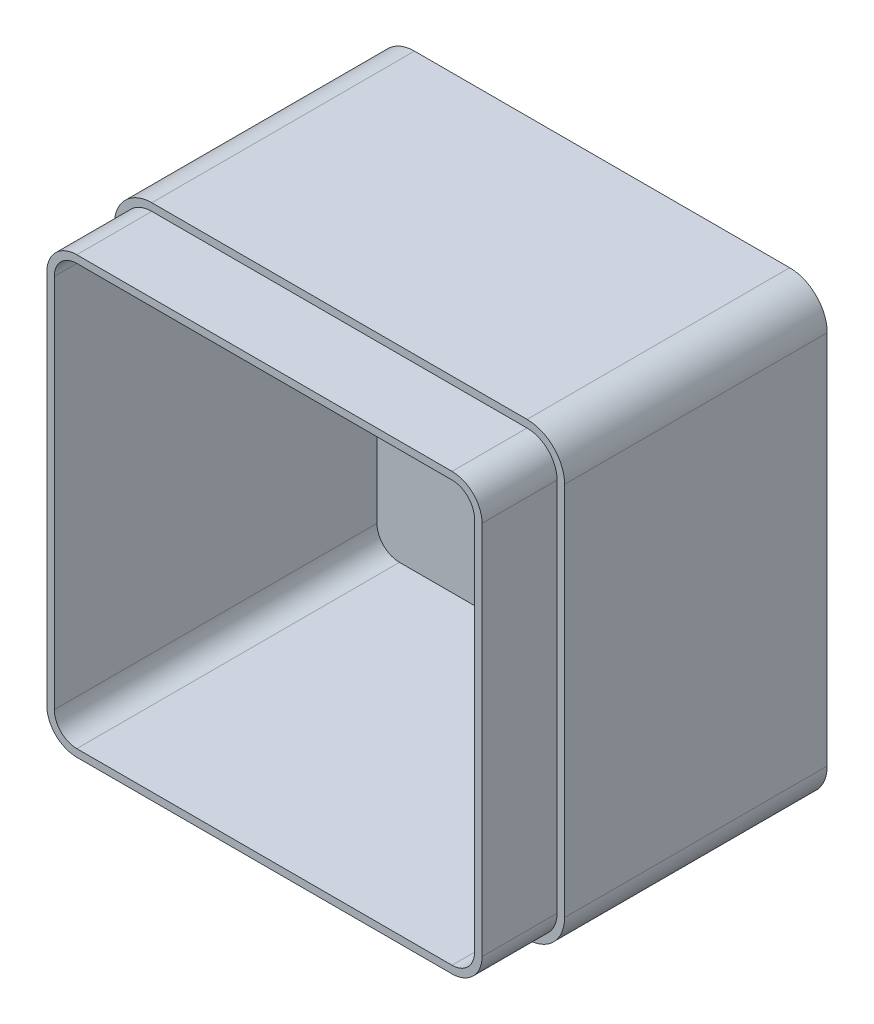
ISO-10303-21;
HEADER;
FILE_DESCRIPTION(('STEP AP214'),'2;1');
FILE_NAME('part.step','',(''),(''),'','','');
FILE_SCHEMA(('AUTOMOTIVE_DESIGN { 1 0 10303 214 1 1 1 1 }'));
ENDSEC;
DATA;
#1=APPLICATION_CONTEXT('core data for automotive mechanical design processes');
#2=APPLICATION_PROTOCOL_DEFINITION('international standard','automotive_design',2000,#1);
#3=PRODUCT_CONTEXT('',#1,'mechanical');
#4=PRODUCT('Part','Part','',(#3));
#5=PRODUCT_RELATED_PRODUCT_CATEGORY('part','',(#4));
#6=PRODUCT_DEFINITION_FORMATION('','',#4);
#7=PRODUCT_DEFINITION_CONTEXT('part definition',#1,'design');
#8=PRODUCT_DEFINITION('design','',#6,#7);
#9=PRODUCT_DEFINITION_SHAPE('','',#8);
#10=(LENGTH_UNIT() NAMED_UNIT(*) SI_UNIT(.MILLI.,.METRE.));
#11=(NAMED_UNIT(*) PLANE_ANGLE_UNIT() SI_UNIT($,.RADIAN.));
#12=(NAMED_UNIT(*) SI_UNIT($,.STERADIAN.) SOLID_ANGLE_UNIT());
#13=UNCERTAINTY_MEASURE_WITH_UNIT(LENGTH_MEASURE(1.E-05),#10,'distance_accuracy_value','');
#14=(GEOMETRIC_REPRESENTATION_CONTEXT(3) GLOBAL_UNCERTAINTY_ASSIGNED_CONTEXT((#13)) GLOBAL_UNIT_ASSIGNED_CONTEXT((#10,
#11,#12)) REPRESENTATION_CONTEXT('',''));
#15=CARTESIAN_POINT('',(0.,0.,0.));
#16=DIRECTION('',(0.,0.,1.));
#17=DIRECTION('',(1.,0.,0.));
#18=AXIS2_PLACEMENT_3D('',#15,#16,#17);
#19=CARTESIAN_POINT('',(0.,0.,90.));
#20=DIRECTION('',(0.,0.,-1.));
#21=DIRECTION('',(-1.,0.,0.));
#22=AXIS2_PLACEMENT_3D('',#19,#20,#21);
#23=PLANE('',#22);
#24=DIRECTION('',(0.,-1.,0.));
#25=VECTOR('',#24,1.);
#26=CARTESIAN_POINT('',(4.,0.,90.));
#27=LINE('',#26,#25);
#28=CARTESIAN_POINT('',(4.,110.,90.));
#29=VERTEX_POINT('',#28);
#30=CARTESIAN_POINT('',(4.,9.99999999999999,90.));
#31=VERTEX_POINT('',#30);
#32=EDGE_CURVE('E304',#29,#31,#27,.T.);
#33=ORIENTED_EDGE('',*,*,#32,.F.);
#34=CARTESIAN_POINT('',(10.,110.,90.));
#35=DIRECTION('',(0.,0.,-1.));
#36=DIRECTION('',(-1.,0.,0.));
#37=AXIS2_PLACEMENT_3D('',#34,#35,#36);
#38=CIRCLE('',#37,6.);
#39=CARTESIAN_POINT('',(9.99999999999999,116.,90.));
#40=VERTEX_POINT('',#39);
#41=EDGE_CURVE('E337',#40,#29,#38,.F.);
#42=ORIENTED_EDGE('',*,*,#41,.F.);
#43=DIRECTION('',(-1.,0.,0.));
#44=VECTOR('',#43,1.);
#45=CARTESIAN_POINT('',(0.,116.,90.));
#46=LINE('',#45,#44);
#47=CARTESIAN_POINT('',(110.,116.,90.));
#48=VERTEX_POINT('',#47);
#49=EDGE_CURVE('E314',#48,#40,#46,.T.);
#50=ORIENTED_EDGE('',*,*,#49,.F.);
#51=CARTESIAN_POINT('',(110.,110.,90.));
#52=DIRECTION('',(0.,0.,-1.));
#53=DIRECTION('',(-1.,0.,0.));
#54=AXIS2_PLACEMENT_3D('',#51,#52,#53);
#55=CIRCLE('',#54,6.);
#56=CARTESIAN_POINT('',(116.,110.,90.));
#57=VERTEX_POINT('',#56);
#58=EDGE_CURVE('E288',#57,#48,#55,.F.);
#59=ORIENTED_EDGE('',*,*,#58,.F.);
#60=DIRECTION('',(0.,1.,0.));
#61=VECTOR('',#60,1.);
#62=CARTESIAN_POINT('',(116.,0.,90.));
#63=LINE('',#62,#61);
#64=CARTESIAN_POINT('',(116.,9.99999999999999,90.));
#65=VERTEX_POINT('',#64);
#66=EDGE_CURVE('E335',#65,#57,#63,.T.);
#67=ORIENTED_EDGE('',*,*,#66,.F.);
#68=CARTESIAN_POINT('',(110.,10.,90.));
#69=DIRECTION('',(0.,0.,-1.));
#70=DIRECTION('',(-1.,0.,0.));
#71=AXIS2_PLACEMENT_3D('',#68,#69,#70);
#72=CIRCLE('',#71,6.);
#73=CARTESIAN_POINT('',(110.,4.,90.));
#74=VERTEX_POINT('',#73);
#75=EDGE_CURVE('E332',#74,#65,#72,.F.);
#76=ORIENTED_EDGE('',*,*,#75,.F.);
#77=DIRECTION('',(1.,0.,0.));
#78=VECTOR('',#77,1.);
#79=CARTESIAN_POINT('',(0.,4.,90.));
#80=LINE('',#79,#78);
#81=CARTESIAN_POINT('',(9.99999999999999,4.,90.));
#82=VERTEX_POINT('',#81);
#83=EDGE_CURVE('E330',#82,#74,#80,.T.);
#84=ORIENTED_EDGE('',*,*,#83,.F.);
#85=CARTESIAN_POINT('',(10.,10.,90.));
#86=DIRECTION('',(0.,0.,-1.));
#87=DIRECTION('',(-1.,0.,0.));
#88=AXIS2_PLACEMENT_3D('',#85,#86,#87);
#89=CIRCLE('',#88,6.);
#90=EDGE_CURVE('E321',#31,#82,#89,.F.);
#91=ORIENTED_EDGE('',*,*,#90,.F.);
#92=EDGE_LOOP('',(#33,#42,#50,#59,#67,#76,#84,#91));
#93=FACE_BOUND('',#92,.T.);
#94=CARTESIAN_POINT('',(10.,110.,90.));
#95=DIRECTION('',(0.,0.,1.));
#96=DIRECTION('',(1.,0.,0.));
#97=AXIS2_PLACEMENT_3D('',#94,#95,#96);
#98=CIRCLE('',#97,8.);
#99=CARTESIAN_POINT('',(9.99999999999999,118.,90.));
#100=VERTEX_POINT('',#99);
#101=CARTESIAN_POINT('',(2.,110.,90.));
#102=VERTEX_POINT('',#101);
#103=EDGE_CURVE('E240',#100,#102,#98,.T.);
#104=ORIENTED_EDGE('',*,*,#103,.T.);
#105=DIRECTION('',(0.,-1.,0.));
#106=VECTOR('',#105,1.);
#107=CARTESIAN_POINT('',(2.,110.,90.));
#108=LINE('',#107,#106);
#109=CARTESIAN_POINT('',(2.,9.99999999999999,90.));
#110=VERTEX_POINT('',#109);
#111=EDGE_CURVE('E200',#102,#110,#108,.T.);
#112=ORIENTED_EDGE('',*,*,#111,.T.);
#113=CARTESIAN_POINT('',(10.,10.,90.));
#114=DIRECTION('',(0.,0.,1.));
#115=DIRECTION('',(1.,0.,0.));
#116=AXIS2_PLACEMENT_3D('',#113,#114,#115);
#117=CIRCLE('',#116,8.);
#118=CARTESIAN_POINT('',(9.99999999999999,2.,90.));
#119=VERTEX_POINT('',#118);
#120=EDGE_CURVE('E48',#110,#119,#117,.T.);
#121=ORIENTED_EDGE('',*,*,#120,.T.);
#122=DIRECTION('',(1.,0.,0.));
#123=VECTOR('',#122,1.);
#124=CARTESIAN_POINT('',(10.,2.,90.));
#125=LINE('',#124,#123);
#126=CARTESIAN_POINT('',(110.,2.,90.));
#127=VERTEX_POINT('',#126);
#128=EDGE_CURVE('E244',#119,#127,#125,.T.);
#129=ORIENTED_EDGE('',*,*,#128,.T.);
#130=CARTESIAN_POINT('',(110.,10.,90.));
#131=DIRECTION('',(0.,0.,1.));
#132=DIRECTION('',(1.,0.,0.));
#133=AXIS2_PLACEMENT_3D('',#130,#131,#132);
#134=CIRCLE('',#133,7.99999999999999);
#135=CARTESIAN_POINT('',(118.,10.,90.));
#136=VERTEX_POINT('',#135);
#137=EDGE_CURVE('E247',#127,#136,#134,.T.);
#138=ORIENTED_EDGE('',*,*,#137,.T.);
#139=DIRECTION('',(0.,1.,0.));
#140=VECTOR('',#139,1.);
#141=CARTESIAN_POINT('',(118.,10.,90.));
#142=LINE('',#141,#140);
#143=CARTESIAN_POINT('',(118.,110.,90.));
#144=VERTEX_POINT('',#143);
#145=EDGE_CURVE('E250',#136,#144,#142,.T.);
#146=ORIENTED_EDGE('',*,*,#145,.T.);
#147=CARTESIAN_POINT('',(110.,110.,90.));
#148=DIRECTION('',(0.,0.,1.));
#149=DIRECTION('',(1.,0.,0.));
#150=AXIS2_PLACEMENT_3D('',#147,#148,#149);
#151=CIRCLE('',#150,7.99999999999999);
#152=CARTESIAN_POINT('',(110.,118.,90.));
#153=VERTEX_POINT('',#152);
#154=EDGE_CURVE('E223',#144,#153,#151,.T.);
#155=ORIENTED_EDGE('',*,*,#154,.T.);
#156=DIRECTION('',(-1.,0.,0.));
#157=VECTOR('',#156,1.);
#158=CARTESIAN_POINT('',(110.,118.,90.));
#159=LINE('',#158,#157);
#160=EDGE_CURVE('E220',#153,#100,#159,.T.);
#161=ORIENTED_EDGE('',*,*,#160,.T.);
#162=EDGE_LOOP('',(#104,#112,#121,#129,#138,#146,#155,#161));
#163=FACE_BOUND('',#162,.T.);
#164=ADVANCED_FACE('F33',(#93,#163),#23,.F.);
#165=CARTESIAN_POINT('',(4.,0.,90.));
#166=DIRECTION('',(1.,0.,0.));
#167=DIRECTION('',(0.,0.,-1.));
#168=AXIS2_PLACEMENT_3D('',#165,#166,#167);
#169=PLANE('',#168);
#170=DIRECTION('',(0.,-1.,0.));
#171=VECTOR('',#170,1.);
#172=CARTESIAN_POINT('',(4.,0.,4.));
#173=LINE('',#172,#171);
#174=CARTESIAN_POINT('',(4.,110.,4.));
#175=VERTEX_POINT('',#174);
#176=CARTESIAN_POINT('',(4.,9.99999999999999,4.));
#177=VERTEX_POINT('',#176);
#178=EDGE_CURVE('E282',#175,#177,#173,.T.);
#179=ORIENTED_EDGE('',*,*,#178,.F.);
#180=DIRECTION('',(0.,0.,-1.));
#181=VECTOR('',#180,1.);
#182=CARTESIAN_POINT('',(4.,110.,90.));
#183=LINE('',#182,#181);
#184=EDGE_CURVE('E289',#29,#175,#183,.T.);
#185=ORIENTED_EDGE('',*,*,#184,.F.);
#186=ORIENTED_EDGE('',*,*,#32,.T.);
#187=DIRECTION('',(0.,0.,-1.));
#188=VECTOR('',#187,1.);
#189=CARTESIAN_POINT('',(4.,9.99999999999999,90.));
#190=LINE('',#189,#188);
#191=EDGE_CURVE('E286',#177,#31,#190,.F.);
#192=ORIENTED_EDGE('',*,*,#191,.F.);
#193=EDGE_LOOP('',(#179,#185,#186,#192));
#194=FACE_BOUND('',#193,.T.);
#195=ADVANCED_FACE('F426',(#194),#169,.T.);
#196=CARTESIAN_POINT('',(0.,4.,90.));
#197=DIRECTION('',(0.,1.,0.));
#198=DIRECTION('',(0.,0.,1.));
#199=AXIS2_PLACEMENT_3D('',#196,#197,#198);
#200=PLANE('',#199);
#201=ORIENTED_EDGE('',*,*,#83,.T.);
#202=DIRECTION('',(0.,0.,1.));
#203=VECTOR('',#202,1.);
#204=CARTESIAN_POINT('',(110.,4.,90.));
#205=LINE('',#204,#203);
#206=CARTESIAN_POINT('',(110.,4.,4.));
#207=VERTEX_POINT('',#206);
#208=EDGE_CURVE('E312',#207,#74,#205,.T.);
#209=ORIENTED_EDGE('',*,*,#208,.F.);
#210=DIRECTION('',(1.,0.,0.));
#211=VECTOR('',#210,1.);
#212=CARTESIAN_POINT('',(0.,4.,4.));
#213=LINE('',#212,#211);
#214=CARTESIAN_POINT('',(9.99999999999999,4.,4.));
#215=VERTEX_POINT('',#214);
#216=EDGE_CURVE('E285',#215,#207,#213,.T.);
#217=ORIENTED_EDGE('',*,*,#216,.F.);
#218=DIRECTION('',(0.,0.,1.));
#219=VECTOR('',#218,1.);
#220=CARTESIAN_POINT('',(9.99999999999999,4.,90.));
#221=LINE('',#220,#219);
#222=EDGE_CURVE('E306',#82,#215,#221,.F.);
#223=ORIENTED_EDGE('',*,*,#222,.F.);
#224=EDGE_LOOP('',(#201,#209,#217,#223));
#225=FACE_BOUND('',#224,.T.);
#226=ADVANCED_FACE('F434',(#225),#200,.T.);
#227=CARTESIAN_POINT('',(116.,0.,90.));
#228=DIRECTION('',(-1.,0.,0.));
#229=DIRECTION('',(0.,0.,1.));
#230=AXIS2_PLACEMENT_3D('',#227,#228,#229);
#231=PLANE('',#230);
#232=ORIENTED_EDGE('',*,*,#66,.T.);
#233=DIRECTION('',(0.,0.,1.));
#234=VECTOR('',#233,1.);
#235=CARTESIAN_POINT('',(116.,110.,90.));
#236=LINE('',#235,#234);
#237=CARTESIAN_POINT('',(116.,110.,4.));
#238=VERTEX_POINT('',#237);
#239=EDGE_CURVE('E319',#238,#57,#236,.T.);
#240=ORIENTED_EDGE('',*,*,#239,.F.);
#241=DIRECTION('',(0.,1.,0.));
#242=VECTOR('',#241,1.);
#243=CARTESIAN_POINT('',(116.,0.,4.));
#244=LINE('',#243,#242);
#245=CARTESIAN_POINT('',(116.,9.99999999999999,4.));
#246=VERTEX_POINT('',#245);
#247=EDGE_CURVE('E295',#246,#238,#244,.T.);
#248=ORIENTED_EDGE('',*,*,#247,.F.);
#249=DIRECTION('',(0.,0.,1.));
#250=VECTOR('',#249,1.);
#251=CARTESIAN_POINT('',(116.,9.99999999999999,90.));
#252=LINE('',#251,#250);
#253=EDGE_CURVE('E315',#65,#246,#252,.F.);
#254=ORIENTED_EDGE('',*,*,#253,.F.);
#255=EDGE_LOOP('',(#232,#240,#248,#254));
#256=FACE_BOUND('',#255,.T.);
#257=ADVANCED_FACE('F554',(#256),#231,.T.);
#258=CARTESIAN_POINT('',(0.,116.,90.));
#259=DIRECTION('',(0.,-1.,0.));
#260=DIRECTION('',(0.,0.,-1.));
#261=AXIS2_PLACEMENT_3D('',#258,#259,#260);
#262=PLANE('',#261);
#263=DIRECTION('',(-1.,0.,0.));
#264=VECTOR('',#263,1.);
#265=CARTESIAN_POINT('',(0.,116.,4.));
#266=LINE('',#265,#264);
#267=CARTESIAN_POINT('',(110.,116.,4.));
#268=VERTEX_POINT('',#267);
#269=CARTESIAN_POINT('',(9.99999999999999,116.,4.));
#270=VERTEX_POINT('',#269);
#271=EDGE_CURVE('E301',#268,#270,#266,.T.);
#272=ORIENTED_EDGE('',*,*,#271,.F.);
#273=DIRECTION('',(0.,0.,-1.));
#274=VECTOR('',#273,1.);
#275=CARTESIAN_POINT('',(110.,116.,90.));
#276=LINE('',#275,#274);
#277=EDGE_CURVE('E318',#48,#268,#276,.T.);
#278=ORIENTED_EDGE('',*,*,#277,.F.);
#279=ORIENTED_EDGE('',*,*,#49,.T.);
#280=DIRECTION('',(0.,0.,-1.));
#281=VECTOR('',#280,1.);
#282=CARTESIAN_POINT('',(9.99999999999999,116.,90.));
#283=LINE('',#282,#281);
#284=EDGE_CURVE('E324',#270,#40,#283,.F.);
#285=ORIENTED_EDGE('',*,*,#284,.F.);
#286=EDGE_LOOP('',(#272,#278,#279,#285));
#287=FACE_BOUND('',#286,.T.);
#288=ADVANCED_FACE('F558',(#287),#262,.T.);
#289=CARTESIAN_POINT('',(0.,0.,4.));
#290=DIRECTION('',(0.,0.,-1.));
#291=DIRECTION('',(-1.,0.,0.));
#292=AXIS2_PLACEMENT_3D('',#289,#290,#291);
#293=PLANE('',#292);
#294=ORIENTED_EDGE('',*,*,#216,.T.);
#295=CARTESIAN_POINT('',(110.,10.,4.));
#296=DIRECTION('',(0.,0.,-1.));
#297=DIRECTION('',(-1.,0.,0.));
#298=AXIS2_PLACEMENT_3D('',#295,#296,#297);
#299=CIRCLE('',#298,6.);
#300=EDGE_CURVE('E297',#246,#207,#299,.T.);
#301=ORIENTED_EDGE('',*,*,#300,.F.);
#302=ORIENTED_EDGE('',*,*,#247,.T.);
#303=CARTESIAN_POINT('',(110.,110.,4.));
#304=DIRECTION('',(0.,0.,-1.));
#305=DIRECTION('',(-1.,0.,0.));
#306=AXIS2_PLACEMENT_3D('',#303,#304,#305);
#307=CIRCLE('',#306,6.);
#308=EDGE_CURVE('E300',#268,#238,#307,.T.);
#309=ORIENTED_EDGE('',*,*,#308,.F.);
#310=ORIENTED_EDGE('',*,*,#271,.T.);
#311=CARTESIAN_POINT('',(10.,110.,4.));
#312=DIRECTION('',(0.,0.,-1.));
#313=DIRECTION('',(-1.,0.,0.));
#314=AXIS2_PLACEMENT_3D('',#311,#312,#313);
#315=CIRCLE('',#314,6.);
#316=EDGE_CURVE('E298',#175,#270,#315,.T.);
#317=ORIENTED_EDGE('',*,*,#316,.F.);
#318=ORIENTED_EDGE('',*,*,#178,.T.);
#319=CARTESIAN_POINT('',(10.,10.,4.));
#320=DIRECTION('',(0.,0.,-1.));
#321=DIRECTION('',(-1.,0.,0.));
#322=AXIS2_PLACEMENT_3D('',#319,#320,#321);
#323=CIRCLE('',#322,6.);
#324=EDGE_CURVE('E292',#215,#177,#323,.T.);
#325=ORIENTED_EDGE('',*,*,#324,.F.);
#326=EDGE_LOOP('',(#294,#301,#302,#309,#310,#317,#318,#325));
#327=FACE_BOUND('',#326,.T.);
#328=ADVANCED_FACE('F562',(#327),#293,.F.);
#329=CARTESIAN_POINT('',(10.,10.,90.));
#330=DIRECTION('',(0.,0.,-1.));
#331=DIRECTION('',(-1.,0.,0.));
#332=AXIS2_PLACEMENT_3D('',#329,#330,#331);
#333=CYLINDRICAL_SURFACE('',#332,6.);
#334=ORIENTED_EDGE('',*,*,#90,.T.);
#335=ORIENTED_EDGE('',*,*,#222,.T.);
#336=ORIENTED_EDGE('',*,*,#324,.T.);
#337=ORIENTED_EDGE('',*,*,#191,.T.);
#338=EDGE_LOOP('',(#334,#335,#336,#337));
#339=FACE_BOUND('',#338,.T.);
#340=ADVANCED_FACE('F566',(#339),#333,.F.);
#341=CARTESIAN_POINT('',(110.,10.,90.));
#342=DIRECTION('',(0.,0.,-1.));
#343=DIRECTION('',(-1.,0.,0.));
#344=AXIS2_PLACEMENT_3D('',#341,#342,#343);
#345=CYLINDRICAL_SURFACE('',#344,6.);
#346=ORIENTED_EDGE('',*,*,#75,.T.);
#347=ORIENTED_EDGE('',*,*,#253,.T.);
#348=ORIENTED_EDGE('',*,*,#300,.T.);
#349=ORIENTED_EDGE('',*,*,#208,.T.);
#350=EDGE_LOOP('',(#346,#347,#348,#349));
#351=FACE_BOUND('',#350,.T.);
#352=ADVANCED_FACE('F570',(#351),#345,.F.);
#353=CARTESIAN_POINT('',(10.,110.,90.));
#354=DIRECTION('',(0.,0.,-1.));
#355=DIRECTION('',(-1.,0.,0.));
#356=AXIS2_PLACEMENT_3D('',#353,#354,#355);
#357=CYLINDRICAL_SURFACE('',#356,6.);
#358=ORIENTED_EDGE('',*,*,#41,.T.);
#359=ORIENTED_EDGE('',*,*,#184,.T.);
#360=ORIENTED_EDGE('',*,*,#316,.T.);
#361=ORIENTED_EDGE('',*,*,#284,.T.);
#362=EDGE_LOOP('',(#358,#359,#360,#361));
#363=FACE_BOUND('',#362,.T.);
#364=ADVANCED_FACE('F573',(#363),#357,.F.);
#365=CARTESIAN_POINT('',(110.,110.,90.));
#366=DIRECTION('',(0.,0.,-1.));
#367=DIRECTION('',(-1.,0.,0.));
#368=AXIS2_PLACEMENT_3D('',#365,#366,#367);
#369=CYLINDRICAL_SURFACE('',#368,6.);
#370=ORIENTED_EDGE('',*,*,#58,.T.);
#371=ORIENTED_EDGE('',*,*,#277,.T.);
#372=ORIENTED_EDGE('',*,*,#308,.T.);
#373=ORIENTED_EDGE('',*,*,#239,.T.);
#374=EDGE_LOOP('',(#370,#371,#372,#373));
#375=FACE_BOUND('',#374,.T.);
#376=ADVANCED_FACE('F441',(#375),#369,.F.);
#377=CARTESIAN_POINT('',(10.,110.,70.));
#378=DIRECTION('',(0.,0.,1.));
#379=DIRECTION('',(1.,0.,0.));
#380=AXIS2_PLACEMENT_3D('',#377,#378,#379);
#381=PLANE('',#380);
#382=DIRECTION('',(-1.,0.,0.));
#383=VECTOR('',#382,1.);
#384=CARTESIAN_POINT('',(110.,118.,70.));
#385=LINE('',#384,#383);
#386=CARTESIAN_POINT('',(110.,118.,70.));
#387=VERTEX_POINT('',#386);
#388=CARTESIAN_POINT('',(9.99999999999999,118.,70.));
#389=VERTEX_POINT('',#388);
#390=EDGE_CURVE('E206',#387,#389,#385,.T.);
#391=ORIENTED_EDGE('',*,*,#390,.F.);
#392=CARTESIAN_POINT('',(110.,110.,70.));
#393=DIRECTION('',(0.,0.,1.));
#394=DIRECTION('',(1.,0.,0.));
#395=AXIS2_PLACEMENT_3D('',#392,#393,#394);
#396=CIRCLE('',#395,7.99999999999999);
#397=CARTESIAN_POINT('',(118.,110.,70.));
#398=VERTEX_POINT('',#397);
#399=EDGE_CURVE('E236',#398,#387,#396,.T.);
#400=ORIENTED_EDGE('',*,*,#399,.F.);
#401=DIRECTION('',(0.,1.,0.));
#402=VECTOR('',#401,1.);
#403=CARTESIAN_POINT('',(118.,10.,70.));
#404=LINE('',#403,#402);
#405=CARTESIAN_POINT('',(118.,10.,70.));
#406=VERTEX_POINT('',#405);
#407=EDGE_CURVE('E233',#406,#398,#404,.T.);
#408=ORIENTED_EDGE('',*,*,#407,.F.);
#409=CARTESIAN_POINT('',(110.,10.,70.));
#410=DIRECTION('',(0.,0.,1.));
#411=DIRECTION('',(1.,0.,0.));
#412=AXIS2_PLACEMENT_3D('',#409,#410,#411);
#413=CIRCLE('',#412,7.99999999999999);
#414=CARTESIAN_POINT('',(110.,2.,70.));
#415=VERTEX_POINT('',#414);
#416=EDGE_CURVE('E230',#415,#406,#413,.T.);
#417=ORIENTED_EDGE('',*,*,#416,.F.);
#418=DIRECTION('',(1.,0.,0.));
#419=VECTOR('',#418,1.);
#420=CARTESIAN_POINT('',(10.,2.,70.));
#421=LINE('',#420,#419);
#422=CARTESIAN_POINT('',(9.99999999999999,2.,70.));
#423=VERTEX_POINT('',#422);
#424=EDGE_CURVE('E227',#423,#415,#421,.T.);
#425=ORIENTED_EDGE('',*,*,#424,.F.);
#426=CARTESIAN_POINT('',(10.,10.,70.));
#427=DIRECTION('',(0.,0.,1.));
#428=DIRECTION('',(1.,0.,0.));
#429=AXIS2_PLACEMENT_3D('',#426,#427,#428);
#430=CIRCLE('',#429,8.);
#431=CARTESIAN_POINT('',(2.,9.99999999999999,70.));
#432=VERTEX_POINT('',#431);
#433=EDGE_CURVE('E216',#432,#423,#430,.T.);
#434=ORIENTED_EDGE('',*,*,#433,.F.);
#435=DIRECTION('',(0.,-1.,0.));
#436=VECTOR('',#435,1.);
#437=CARTESIAN_POINT('',(2.,110.,70.));
#438=LINE('',#437,#436);
#439=CARTESIAN_POINT('',(2.,110.,70.));
#440=VERTEX_POINT('',#439);
#441=EDGE_CURVE('E198',#440,#432,#438,.T.);
#442=ORIENTED_EDGE('',*,*,#441,.F.);
#443=CARTESIAN_POINT('',(10.,110.,70.));
#444=DIRECTION('',(0.,0.,1.));
#445=DIRECTION('',(1.,0.,0.));
#446=AXIS2_PLACEMENT_3D('',#443,#444,#445);
#447=CIRCLE('',#446,8.);
#448=EDGE_CURVE('E212',#389,#440,#447,.T.);
#449=ORIENTED_EDGE('',*,*,#448,.F.);
#450=EDGE_LOOP('',(#391,#400,#408,#417,#425,#434,#442,#449));
#451=FACE_BOUND('',#450,.T.);
#452=CARTESIAN_POINT('',(10.,110.,70.));
#453=DIRECTION('',(0.,0.,1.));
#454=DIRECTION('',(1.,0.,0.));
#455=AXIS2_PLACEMENT_3D('',#452,#453,#454);
#456=CIRCLE('',#455,10.);
#457=CARTESIAN_POINT('',(10.,120.,70.));
#458=VERTEX_POINT('',#457);
#459=CARTESIAN_POINT('',(0.,110.,70.));
#460=VERTEX_POINT('',#459);
#461=EDGE_CURVE('E256',#458,#460,#456,.T.);
#462=ORIENTED_EDGE('',*,*,#461,.T.);
#463=DIRECTION('',(0.,-1.,0.));
#464=VECTOR('',#463,1.);
#465=CARTESIAN_POINT('',(0.,110.,70.));
#466=LINE('',#465,#464);
#467=CARTESIAN_POINT('',(0.,10.,70.));
#468=VERTEX_POINT('',#467);
#469=EDGE_CURVE('E269',#460,#468,#466,.T.);
#470=ORIENTED_EDGE('',*,*,#469,.T.);
#471=CARTESIAN_POINT('',(10.,10.,70.));
#472=DIRECTION('',(0.,0.,1.));
#473=DIRECTION('',(1.,0.,0.));
#474=AXIS2_PLACEMENT_3D('',#471,#472,#473);
#475=CIRCLE('',#474,10.);
#476=CARTESIAN_POINT('',(9.99999999999999,0.,70.));
#477=VERTEX_POINT('',#476);
#478=EDGE_CURVE('E271',#468,#477,#475,.T.);
#479=ORIENTED_EDGE('',*,*,#478,.T.);
#480=DIRECTION('',(1.,0.,0.));
#481=VECTOR('',#480,1.);
#482=CARTESIAN_POINT('',(9.99999999999999,0.,70.));
#483=LINE('',#482,#481);
#484=CARTESIAN_POINT('',(110.,0.,70.));
#485=VERTEX_POINT('',#484);
#486=EDGE_CURVE('E273',#477,#485,#483,.T.);
#487=ORIENTED_EDGE('',*,*,#486,.T.);
#488=CARTESIAN_POINT('',(110.,10.,70.));
#489=DIRECTION('',(0.,0.,1.));
#490=DIRECTION('',(1.,0.,0.));
#491=AXIS2_PLACEMENT_3D('',#488,#489,#490);
#492=CIRCLE('',#491,9.99999999999999);
#493=CARTESIAN_POINT('',(120.,10.,70.));
#494=VERTEX_POINT('',#493);
#495=EDGE_CURVE('E275',#485,#494,#492,.T.);
#496=ORIENTED_EDGE('',*,*,#495,.T.);
#497=DIRECTION('',(0.,1.,0.));
#498=VECTOR('',#497,1.);
#499=CARTESIAN_POINT('',(120.,10.,70.));
#500=LINE('',#499,#498);
#501=CARTESIAN_POINT('',(120.,110.,70.));
#502=VERTEX_POINT('',#501);
#503=EDGE_CURVE('E56',#494,#502,#500,.T.);
#504=ORIENTED_EDGE('',*,*,#503,.T.);
#505=CARTESIAN_POINT('',(110.,110.,70.));
#506=DIRECTION('',(0.,0.,1.));
#507=DIRECTION('',(1.,0.,0.));
#508=AXIS2_PLACEMENT_3D('',#505,#506,#507);
#509=CIRCLE('',#508,9.99999999999999);
#510=CARTESIAN_POINT('',(110.,120.,70.));
#511=VERTEX_POINT('',#510);
#512=EDGE_CURVE('E278',#502,#511,#509,.T.);
#513=ORIENTED_EDGE('',*,*,#512,.T.);
#514=DIRECTION('',(-1.,0.,0.));
#515=VECTOR('',#514,1.);
#516=CARTESIAN_POINT('',(110.,120.,70.));
#517=LINE('',#516,#515);
#518=EDGE_CURVE('E280',#511,#458,#517,.T.);
#519=ORIENTED_EDGE('',*,*,#518,.T.);
#520=EDGE_LOOP('',(#462,#470,#479,#487,#496,#504,#513,#519));
#521=FACE_BOUND('',#520,.T.);
#522=ADVANCED_FACE('F211',(#451,#521),#381,.T.);
#523=CARTESIAN_POINT('',(10.,110.,70.));
#524=DIRECTION('',(0.,0.,1.));
#525=DIRECTION('',(1.,0.,0.));
#526=AXIS2_PLACEMENT_3D('',#523,#524,#525);
#527=CYLINDRICAL_SURFACE('',#526,8.);
#528=ORIENTED_EDGE('',*,*,#103,.F.);
#529=DIRECTION('',(0.,0.,1.));
#530=VECTOR('',#529,1.);
#531=CARTESIAN_POINT('',(9.99999999999999,118.,70.));
#532=LINE('',#531,#530);
#533=EDGE_CURVE('E219',#389,#100,#532,.T.);
#534=ORIENTED_EDGE('',*,*,#533,.F.);
#535=ORIENTED_EDGE('',*,*,#448,.T.);
#536=DIRECTION('',(0.,0.,1.));
#537=VECTOR('',#536,1.);
#538=CARTESIAN_POINT('',(2.,110.,70.));
#539=LINE('',#538,#537);
#540=EDGE_CURVE('E195',#440,#102,#539,.T.);
#541=ORIENTED_EDGE('',*,*,#540,.T.);
#542=EDGE_LOOP('',(#528,#534,#535,#541));
#543=FACE_BOUND('',#542,.T.);
#544=ADVANCED_FACE('F218',(#543),#527,.T.);
#545=CARTESIAN_POINT('',(110.,118.,70.));
#546=DIRECTION('',(0.,1.,0.));
#547=DIRECTION('',(0.,0.,1.));
#548=AXIS2_PLACEMENT_3D('',#545,#546,#547);
#549=PLANE('',#548);
#550=ORIENTED_EDGE('',*,*,#160,.F.);
#551=DIRECTION('',(0.,0.,1.));
#552=VECTOR('',#551,1.);
#553=CARTESIAN_POINT('',(110.,118.,70.));
#554=LINE('',#553,#552);
#555=EDGE_CURVE('E257',#387,#153,#554,.T.);
#556=ORIENTED_EDGE('',*,*,#555,.F.);
#557=ORIENTED_EDGE('',*,*,#390,.T.);
#558=ORIENTED_EDGE('',*,*,#533,.T.);
#559=EDGE_LOOP('',(#550,#556,#557,#558));
#560=FACE_BOUND('',#559,.T.);
#561=ADVANCED_FACE('F482',(#560),#549,.T.);
#562=CARTESIAN_POINT('',(110.,110.,70.));
#563=DIRECTION('',(0.,0.,1.));
#564=DIRECTION('',(1.,0.,0.));
#565=AXIS2_PLACEMENT_3D('',#562,#563,#564);
#566=CYLINDRICAL_SURFACE('',#565,7.99999999999999);
#567=ORIENTED_EDGE('',*,*,#154,.F.);
#568=DIRECTION('',(0.,0.,1.));
#569=VECTOR('',#568,1.);
#570=CARTESIAN_POINT('',(118.,110.,70.));
#571=LINE('',#570,#569);
#572=EDGE_CURVE('E259',#398,#144,#571,.T.);
#573=ORIENTED_EDGE('',*,*,#572,.F.);
#574=ORIENTED_EDGE('',*,*,#399,.T.);
#575=ORIENTED_EDGE('',*,*,#555,.T.);
#576=EDGE_LOOP('',(#567,#573,#574,#575));
#577=FACE_BOUND('',#576,.T.);
#578=ADVANCED_FACE('F490',(#577),#566,.T.);
#579=CARTESIAN_POINT('',(118.,10.,70.));
#580=DIRECTION('',(1.,0.,0.));
#581=DIRECTION('',(0.,0.,-1.));
#582=AXIS2_PLACEMENT_3D('',#579,#580,#581);
#583=PLANE('',#582);
#584=ORIENTED_EDGE('',*,*,#145,.F.);
#585=DIRECTION('',(0.,0.,1.));
#586=VECTOR('',#585,1.);
#587=CARTESIAN_POINT('',(118.,10.,70.));
#588=LINE('',#587,#586);
#589=EDGE_CURVE('E261',#406,#136,#588,.T.);
#590=ORIENTED_EDGE('',*,*,#589,.F.);
#591=ORIENTED_EDGE('',*,*,#407,.T.);
#592=ORIENTED_EDGE('',*,*,#572,.T.);
#593=EDGE_LOOP('',(#584,#590,#591,#592));
#594=FACE_BOUND('',#593,.T.);
#595=ADVANCED_FACE('F499',(#594),#583,.T.);
#596=CARTESIAN_POINT('',(110.,10.,70.));
#597=DIRECTION('',(0.,0.,1.));
#598=DIRECTION('',(1.,0.,0.));
#599=AXIS2_PLACEMENT_3D('',#596,#597,#598);
#600=CYLINDRICAL_SURFACE('',#599,7.99999999999999);
#601=ORIENTED_EDGE('',*,*,#137,.F.);
#602=DIRECTION('',(0.,0.,1.));
#603=VECTOR('',#602,1.);
#604=CARTESIAN_POINT('',(110.,2.,70.));
#605=LINE('',#604,#603);
#606=EDGE_CURVE('E263',#415,#127,#605,.T.);
#607=ORIENTED_EDGE('',*,*,#606,.F.);
#608=ORIENTED_EDGE('',*,*,#416,.T.);
#609=ORIENTED_EDGE('',*,*,#589,.T.);
#610=EDGE_LOOP('',(#601,#607,#608,#609));
#611=FACE_BOUND('',#610,.T.);
#612=ADVANCED_FACE('F508',(#611),#600,.T.);
#613=CARTESIAN_POINT('',(10.,2.,70.));
#614=DIRECTION('',(0.,-1.,0.));
#615=DIRECTION('',(0.,0.,-1.));
#616=AXIS2_PLACEMENT_3D('',#613,#614,#615);
#617=PLANE('',#616);
#618=ORIENTED_EDGE('',*,*,#128,.F.);
#619=DIRECTION('',(0.,0.,1.));
#620=VECTOR('',#619,1.);
#621=CARTESIAN_POINT('',(9.99999999999999,2.,70.));
#622=LINE('',#621,#620);
#623=EDGE_CURVE('E265',#423,#119,#622,.T.);
#624=ORIENTED_EDGE('',*,*,#623,.F.);
#625=ORIENTED_EDGE('',*,*,#424,.T.);
#626=ORIENTED_EDGE('',*,*,#606,.T.);
#627=EDGE_LOOP('',(#618,#624,#625,#626));
#628=FACE_BOUND('',#627,.T.);
#629=ADVANCED_FACE('F517',(#628),#617,.T.);
#630=CARTESIAN_POINT('',(10.,10.,70.));
#631=DIRECTION('',(0.,0.,1.));
#632=DIRECTION('',(1.,0.,0.));
#633=AXIS2_PLACEMENT_3D('',#630,#631,#632);
#634=CYLINDRICAL_SURFACE('',#633,8.);
#635=ORIENTED_EDGE('',*,*,#120,.F.);
#636=DIRECTION('',(0.,0.,1.));
#637=VECTOR('',#636,1.);
#638=CARTESIAN_POINT('',(2.,9.99999999999999,70.));
#639=LINE('',#638,#637);
#640=EDGE_CURVE('E205',#432,#110,#639,.T.);
#641=ORIENTED_EDGE('',*,*,#640,.F.);
#642=ORIENTED_EDGE('',*,*,#433,.T.);
#643=ORIENTED_EDGE('',*,*,#623,.T.);
#644=EDGE_LOOP('',(#635,#641,#642,#643));
#645=FACE_BOUND('',#644,.T.);
#646=ADVANCED_FACE('F526',(#645),#634,.T.);
#647=CARTESIAN_POINT('',(2.,110.,70.));
#648=DIRECTION('',(-1.,0.,0.));
#649=DIRECTION('',(0.,0.,1.));
#650=AXIS2_PLACEMENT_3D('',#647,#648,#649);
#651=PLANE('',#650);
#652=ORIENTED_EDGE('',*,*,#111,.F.);
#653=ORIENTED_EDGE('',*,*,#540,.F.);
#654=ORIENTED_EDGE('',*,*,#441,.T.);
#655=ORIENTED_EDGE('',*,*,#640,.T.);
#656=EDGE_LOOP('',(#652,#653,#654,#655));
#657=FACE_BOUND('',#656,.T.);
#658=ADVANCED_FACE('F197',(#657),#651,.T.);
#659=CARTESIAN_POINT('',(0.,0.,0.));
#660=DIRECTION('',(0.,0.,-1.));
#661=DIRECTION('',(-1.,0.,0.));
#662=AXIS2_PLACEMENT_3D('',#659,#660,#661);
#663=PLANE('',#662);
#664=DIRECTION('',(1.,0.,0.));
#665=VECTOR('',#664,1.);
#666=CARTESIAN_POINT('',(0.,0.,0.));
#667=LINE('',#666,#665);
#668=CARTESIAN_POINT('',(10.,0.,0.));
#669=VERTEX_POINT('',#668);
#670=CARTESIAN_POINT('',(110.,0.,0.));
#671=VERTEX_POINT('',#670);
#672=EDGE_CURVE('E345',#669,#671,#667,.T.);
#673=ORIENTED_EDGE('',*,*,#672,.F.);
#674=CARTESIAN_POINT('',(10.,10.,0.));
#675=DIRECTION('',(0.,0.,-1.));
#676=DIRECTION('',(-1.,0.,0.));
#677=AXIS2_PLACEMENT_3D('',#674,#675,#676);
#678=CIRCLE('',#677,10.);
#679=CARTESIAN_POINT('',(0.,10.,0.));
#680=VERTEX_POINT('',#679);
#681=EDGE_CURVE('E365',#669,#680,#678,.T.);
#682=ORIENTED_EDGE('',*,*,#681,.T.);
#683=DIRECTION('',(0.,-1.,0.));
#684=VECTOR('',#683,1.);
#685=CARTESIAN_POINT('',(0.,0.,0.));
#686=LINE('',#685,#684);
#687=CARTESIAN_POINT('',(0.,110.,0.));
#688=VERTEX_POINT('',#687);
#689=EDGE_CURVE('E327',#688,#680,#686,.T.);
#690=ORIENTED_EDGE('',*,*,#689,.F.);
#691=CARTESIAN_POINT('',(10.,110.,0.));
#692=DIRECTION('',(0.,0.,-1.));
#693=DIRECTION('',(-1.,0.,0.));
#694=AXIS2_PLACEMENT_3D('',#691,#692,#693);
#695=CIRCLE('',#694,10.);
#696=CARTESIAN_POINT('',(10.,120.,0.));
#697=VERTEX_POINT('',#696);
#698=EDGE_CURVE('E361',#688,#697,#695,.T.);
#699=ORIENTED_EDGE('',*,*,#698,.T.);
#700=DIRECTION('',(-1.,0.,0.));
#701=VECTOR('',#700,1.);
#702=CARTESIAN_POINT('',(0.,120.,0.));
#703=LINE('',#702,#701);
#704=CARTESIAN_POINT('',(110.,120.,0.));
#705=VERTEX_POINT('',#704);
#706=EDGE_CURVE('E351',#705,#697,#703,.T.);
#707=ORIENTED_EDGE('',*,*,#706,.F.);
#708=CARTESIAN_POINT('',(110.,110.,0.));
#709=DIRECTION('',(0.,0.,-1.));
#710=DIRECTION('',(-1.,0.,0.));
#711=AXIS2_PLACEMENT_3D('',#708,#709,#710);
#712=CIRCLE('',#711,10.);
#713=CARTESIAN_POINT('',(120.,110.,0.));
#714=VERTEX_POINT('',#713);
#715=EDGE_CURVE('E359',#705,#714,#712,.T.);
#716=ORIENTED_EDGE('',*,*,#715,.T.);
#717=DIRECTION('',(0.,1.,0.));
#718=VECTOR('',#717,1.);
#719=CARTESIAN_POINT('',(120.,0.,0.));
#720=LINE('',#719,#718);
#721=CARTESIAN_POINT('',(120.,10.,0.));
#722=VERTEX_POINT('',#721);
#723=EDGE_CURVE('E348',#722,#714,#720,.T.);
#724=ORIENTED_EDGE('',*,*,#723,.F.);
#725=CARTESIAN_POINT('',(110.,10.,0.));
#726=DIRECTION('',(0.,0.,-1.));
#727=DIRECTION('',(-1.,0.,0.));
#728=AXIS2_PLACEMENT_3D('',#725,#726,#727);
#729=CIRCLE('',#728,10.);
#730=EDGE_CURVE('E363',#722,#671,#729,.T.);
#731=ORIENTED_EDGE('',*,*,#730,.T.);
#732=EDGE_LOOP('',(#673,#682,#690,#699,#707,#716,#724,#731));
#733=FACE_BOUND('',#732,.T.);
#734=ADVANCED_FACE('F388',(#733),#663,.T.);
#735=CARTESIAN_POINT('',(10.,110.,90.));
#736=DIRECTION('',(0.,0.,-1.));
#737=DIRECTION('',(-1.,0.,0.));
#738=AXIS2_PLACEMENT_3D('',#735,#736,#737);
#739=CYLINDRICAL_SURFACE('',#738,10.);
#740=DIRECTION('',(0.,0.,-1.));
#741=VECTOR('',#740,1.);
#742=CARTESIAN_POINT('',(0.,110.,90.));
#743=LINE('',#742,#741);
#744=EDGE_CURVE('E367',#460,#688,#743,.T.);
#745=ORIENTED_EDGE('',*,*,#744,.F.);
#746=ORIENTED_EDGE('',*,*,#461,.F.);
#747=DIRECTION('',(0.,0.,-1.));
#748=VECTOR('',#747,1.);
#749=CARTESIAN_POINT('',(10.,120.,90.));
#750=LINE('',#749,#748);
#751=EDGE_CURVE('E11',#697,#458,#750,.F.);
#752=ORIENTED_EDGE('',*,*,#751,.F.);
#753=ORIENTED_EDGE('',*,*,#698,.F.);
#754=EDGE_LOOP('',(#745,#746,#752,#753));
#755=FACE_BOUND('',#754,.T.);
#756=ADVANCED_FACE('F393',(#755),#739,.T.);
#757=CARTESIAN_POINT('',(110.,110.,90.));
#758=DIRECTION('',(0.,0.,-1.));
#759=DIRECTION('',(-1.,0.,0.));
#760=AXIS2_PLACEMENT_3D('',#757,#758,#759);
#761=CYLINDRICAL_SURFACE('',#760,10.);
#762=DIRECTION('',(0.,0.,-1.));
#763=VECTOR('',#762,1.);
#764=CARTESIAN_POINT('',(110.,120.,90.));
#765=LINE('',#764,#763);
#766=EDGE_CURVE('E41',#511,#705,#765,.T.);
#767=ORIENTED_EDGE('',*,*,#766,.F.);
#768=ORIENTED_EDGE('',*,*,#512,.F.);
#769=DIRECTION('',(0.,0.,-1.));
#770=VECTOR('',#769,1.);
#771=CARTESIAN_POINT('',(120.,110.,90.));
#772=LINE('',#771,#770);
#773=EDGE_CURVE('E372',#714,#502,#772,.F.);
#774=ORIENTED_EDGE('',*,*,#773,.F.);
#775=ORIENTED_EDGE('',*,*,#715,.F.);
#776=EDGE_LOOP('',(#767,#768,#774,#775));
#777=FACE_BOUND('',#776,.T.);
#778=ADVANCED_FACE('F35',(#777),#761,.T.);
#779=CARTESIAN_POINT('',(0.,120.,90.));
#780=DIRECTION('',(0.,-1.,0.));
#781=DIRECTION('',(0.,0.,-1.));
#782=AXIS2_PLACEMENT_3D('',#779,#780,#781);
#783=PLANE('',#782);
#784=ORIENTED_EDGE('',*,*,#518,.F.);
#785=ORIENTED_EDGE('',*,*,#766,.T.);
#786=ORIENTED_EDGE('',*,*,#706,.T.);
#787=ORIENTED_EDGE('',*,*,#751,.T.);
#788=EDGE_LOOP('',(#784,#785,#786,#787));
#789=FACE_BOUND('',#788,.T.);
#790=ADVANCED_FACE('F380',(#789),#783,.F.);
#791=CARTESIAN_POINT('',(110.,10.,90.));
#792=DIRECTION('',(0.,0.,-1.));
#793=DIRECTION('',(-1.,0.,0.));
#794=AXIS2_PLACEMENT_3D('',#791,#792,#793);
#795=CYLINDRICAL_SURFACE('',#794,10.);
#796=DIRECTION('',(0.,0.,-1.));
#797=VECTOR('',#796,1.);
#798=CARTESIAN_POINT('',(120.,10.,90.));
#799=LINE('',#798,#797);
#800=EDGE_CURVE('E375',#494,#722,#799,.T.);
#801=ORIENTED_EDGE('',*,*,#800,.F.);
#802=ORIENTED_EDGE('',*,*,#495,.F.);
#803=DIRECTION('',(0.,0.,-1.));
#804=VECTOR('',#803,1.);
#805=CARTESIAN_POINT('',(110.,0.,90.));
#806=LINE('',#805,#804);
#807=EDGE_CURVE('E354',#671,#485,#806,.F.);
#808=ORIENTED_EDGE('',*,*,#807,.F.);
#809=ORIENTED_EDGE('',*,*,#730,.F.);
#810=EDGE_LOOP('',(#801,#802,#808,#809));
#811=FACE_BOUND('',#810,.T.);
#812=ADVANCED_FACE('F412',(#811),#795,.T.);
#813=CARTESIAN_POINT('',(120.,0.,90.));
#814=DIRECTION('',(-1.,0.,0.));
#815=DIRECTION('',(0.,0.,1.));
#816=AXIS2_PLACEMENT_3D('',#813,#814,#815);
#817=PLANE('',#816);
#818=ORIENTED_EDGE('',*,*,#503,.F.);
#819=ORIENTED_EDGE('',*,*,#800,.T.);
#820=ORIENTED_EDGE('',*,*,#723,.T.);
#821=ORIENTED_EDGE('',*,*,#773,.T.);
#822=EDGE_LOOP('',(#818,#819,#820,#821));
#823=FACE_BOUND('',#822,.T.);
#824=ADVANCED_FACE('F414',(#823),#817,.F.);
#825=CARTESIAN_POINT('',(10.,10.,90.));
#826=DIRECTION('',(0.,0.,-1.));
#827=DIRECTION('',(-1.,0.,0.));
#828=AXIS2_PLACEMENT_3D('',#825,#826,#827);
#829=CYLINDRICAL_SURFACE('',#828,10.);
#830=DIRECTION('',(0.,0.,-1.));
#831=VECTOR('',#830,1.);
#832=CARTESIAN_POINT('',(10.,0.,90.));
#833=LINE('',#832,#831);
#834=EDGE_CURVE('E357',#477,#669,#833,.T.);
#835=ORIENTED_EDGE('',*,*,#834,.F.);
#836=ORIENTED_EDGE('',*,*,#478,.F.);
#837=DIRECTION('',(0.,0.,-1.));
#838=VECTOR('',#837,1.);
#839=CARTESIAN_POINT('',(0.,10.,90.));
#840=LINE('',#839,#838);
#841=EDGE_CURVE('E369',#680,#468,#840,.F.);
#842=ORIENTED_EDGE('',*,*,#841,.F.);
#843=ORIENTED_EDGE('',*,*,#681,.F.);
#844=EDGE_LOOP('',(#835,#836,#842,#843));
#845=FACE_BOUND('',#844,.T.);
#846=ADVANCED_FACE('F403',(#845),#829,.T.);
#847=CARTESIAN_POINT('',(0.,0.,90.));
#848=DIRECTION('',(0.,1.,0.));
#849=DIRECTION('',(0.,0.,1.));
#850=AXIS2_PLACEMENT_3D('',#847,#848,#849);
#851=PLANE('',#850);
#852=ORIENTED_EDGE('',*,*,#486,.F.);
#853=ORIENTED_EDGE('',*,*,#834,.T.);
#854=ORIENTED_EDGE('',*,*,#672,.T.);
#855=ORIENTED_EDGE('',*,*,#807,.T.);
#856=EDGE_LOOP('',(#852,#853,#854,#855));
#857=FACE_BOUND('',#856,.T.);
#858=ADVANCED_FACE('F407',(#857),#851,.F.);
#859=CARTESIAN_POINT('',(0.,0.,90.));
#860=DIRECTION('',(1.,0.,0.));
#861=DIRECTION('',(0.,0.,-1.));
#862=AXIS2_PLACEMENT_3D('',#859,#860,#861);
#863=PLANE('',#862);
#864=ORIENTED_EDGE('',*,*,#469,.F.);
#865=ORIENTED_EDGE('',*,*,#744,.T.);
#866=ORIENTED_EDGE('',*,*,#689,.T.);
#867=ORIENTED_EDGE('',*,*,#841,.T.);
#868=EDGE_LOOP('',(#864,#865,#866,#867));
#869=FACE_BOUND('',#868,.T.);
#870=ADVANCED_FACE('F398',(#869),#863,.F.);
#871=CLOSED_SHELL('',(#164,#195,#226,#257,#288,#328,#340,#352,#364,#376,#522,#544,#561,#578,
#595,#612,#629,#646,#658,#734,#756,#778,#790,#812,#824,#846,#858,#870));
#872=MANIFOLD_SOLID_BREP('B2',#871);
#873=ADVANCED_BREP_SHAPE_REPRESENTATION('',(#18,#872),#14);
#874=SHAPE_DEFINITION_REPRESENTATION(#9,#873);
ENDSEC;
END-ISO-10303-21;
